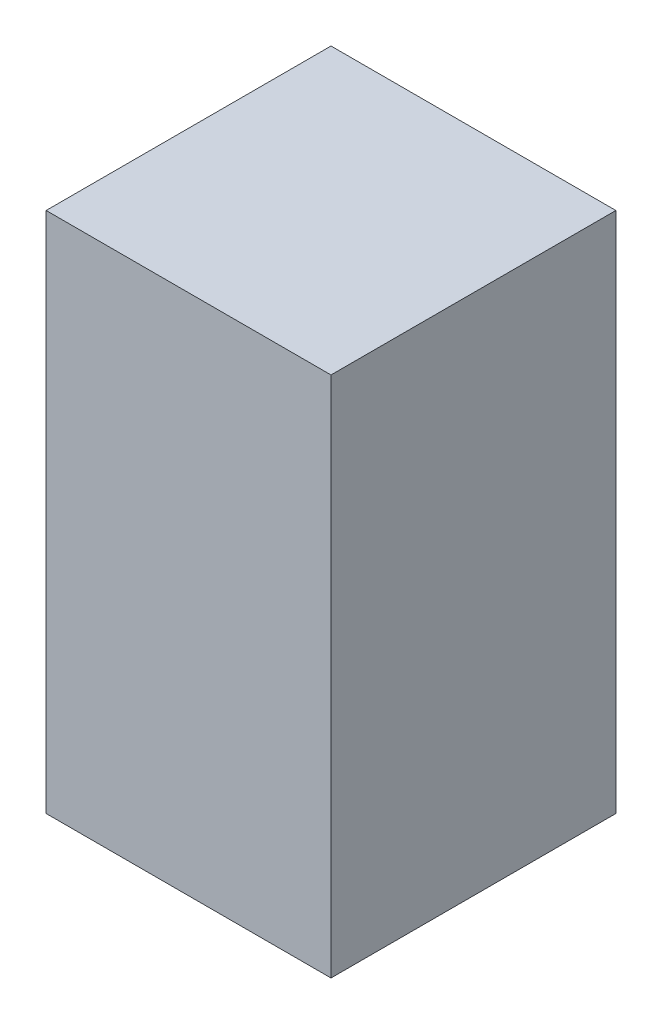
ISO-10303-21;
HEADER;
FILE_DESCRIPTION(('STEP AP214'),'2;1');
FILE_NAME('part.step','',(''),(''),'','','');
FILE_SCHEMA(('AUTOMOTIVE_DESIGN { 1 0 10303 214 1 1 1 1 }'));
ENDSEC;
DATA;
#1=APPLICATION_CONTEXT('core data for automotive mechanical design processes');
#2=APPLICATION_PROTOCOL_DEFINITION('international standard','automotive_design',2000,#1);
#3=PRODUCT_CONTEXT('',#1,'mechanical');
#4=PRODUCT('Part','Part','',(#3));
#5=PRODUCT_RELATED_PRODUCT_CATEGORY('part','',(#4));
#6=PRODUCT_DEFINITION_FORMATION('','',#4);
#7=PRODUCT_DEFINITION_CONTEXT('part definition',#1,'design');
#8=PRODUCT_DEFINITION('design','',#6,#7);
#9=PRODUCT_DEFINITION_SHAPE('','',#8);
#10=(LENGTH_UNIT() NAMED_UNIT(*) SI_UNIT(.MILLI.,.METRE.));
#11=(NAMED_UNIT(*) PLANE_ANGLE_UNIT() SI_UNIT($,.RADIAN.));
#12=(NAMED_UNIT(*) SI_UNIT($,.STERADIAN.) SOLID_ANGLE_UNIT());
#13=UNCERTAINTY_MEASURE_WITH_UNIT(LENGTH_MEASURE(1.E-05),#10,'distance_accuracy_value','');
#14=(GEOMETRIC_REPRESENTATION_CONTEXT(3) GLOBAL_UNCERTAINTY_ASSIGNED_CONTEXT((#13)) GLOBAL_UNIT_ASSIGNED_CONTEXT((#10,
#11,#12)) REPRESENTATION_CONTEXT('',''));
#15=CARTESIAN_POINT('',(0.,0.,0.));
#16=DIRECTION('',(0.,0.,1.));
#17=DIRECTION('',(1.,0.,0.));
#18=AXIS2_PLACEMENT_3D('',#15,#16,#17);
#19=CARTESIAN_POINT('',(0.90000074,1.65000178,1.79999894));
#20=DIRECTION('',(0.,0.,-1.));
#21=DIRECTION('',(0.,-1.,0.));
#22=AXIS2_PLACEMENT_3D('',#19,#20,#21);
#23=PLANE('',#22);
#24=DIRECTION('',(-1.,0.,0.));
#25=VECTOR('',#24,1.);
#26=CARTESIAN_POINT('',(0.90000074,1.65000178,1.79999894));
#27=LINE('',#26,#25);
#28=CARTESIAN_POINT('',(0.90000074,1.65000178,1.79999894));
#29=VERTEX_POINT('',#28);
#30=CARTESIAN_POINT('',(-0.8999982,1.65000178,1.79999894));
#31=VERTEX_POINT('',#30);
#32=EDGE_CURVE('E75',#29,#31,#27,.T.);
#33=ORIENTED_EDGE('',*,*,#32,.T.);
#34=DIRECTION('',(0.,-1.,0.));
#35=VECTOR('',#34,1.);
#36=CARTESIAN_POINT('',(-0.8999982,1.65000178,1.79999894));
#37=LINE('',#36,#35);
#38=CARTESIAN_POINT('',(-0.8999982,-1.64999924,1.79999894));
#39=VERTEX_POINT('',#38);
#40=EDGE_CURVE('E99',#31,#39,#37,.T.);
#41=ORIENTED_EDGE('',*,*,#40,.T.);
#42=DIRECTION('',(1.,0.,0.));
#43=VECTOR('',#42,1.);
#44=CARTESIAN_POINT('',(-0.8999982,-1.64999924,1.79999894));
#45=LINE('',#44,#43);
#46=CARTESIAN_POINT('',(0.90000074,-1.64999924,1.79999894));
#47=VERTEX_POINT('',#46);
#48=EDGE_CURVE('E78',#39,#47,#45,.T.);
#49=ORIENTED_EDGE('',*,*,#48,.T.);
#50=DIRECTION('',(0.,1.,0.));
#51=VECTOR('',#50,1.);
#52=CARTESIAN_POINT('',(0.90000074,-1.64999924,1.79999894));
#53=LINE('',#52,#51);
#54=EDGE_CURVE('E11',#47,#29,#53,.T.);
#55=ORIENTED_EDGE('',*,*,#54,.T.);
#56=EDGE_LOOP('',(#33,#41,#49,#55));
#57=FACE_BOUND('',#56,.T.);
#58=ADVANCED_FACE('F16',(#57),#23,.F.);
#59=CARTESIAN_POINT('',(0.90000074,1.65000178,0.));
#60=DIRECTION('',(0.,0.,-1.));
#61=DIRECTION('',(0.,-1.,0.));
#62=AXIS2_PLACEMENT_3D('',#59,#60,#61);
#63=PLANE('',#62);
#64=DIRECTION('',(0.,1.,0.));
#65=VECTOR('',#64,1.);
#66=CARTESIAN_POINT('',(0.90000074,-1.64999924,0.));
#67=LINE('',#66,#65);
#68=CARTESIAN_POINT('',(0.90000074,-1.64999924,0.));
#69=VERTEX_POINT('',#68);
#70=CARTESIAN_POINT('',(0.90000074,1.65000178,0.));
#71=VERTEX_POINT('',#70);
#72=EDGE_CURVE('E27',#69,#71,#67,.T.);
#73=ORIENTED_EDGE('',*,*,#72,.F.);
#74=DIRECTION('',(1.,0.,0.));
#75=VECTOR('',#74,1.);
#76=CARTESIAN_POINT('',(-0.8999982,-1.64999924,0.));
#77=LINE('',#76,#75);
#78=CARTESIAN_POINT('',(-0.8999982,-1.64999924,0.));
#79=VERTEX_POINT('',#78);
#80=EDGE_CURVE('E102',#79,#69,#77,.T.);
#81=ORIENTED_EDGE('',*,*,#80,.F.);
#82=DIRECTION('',(0.,-1.,0.));
#83=VECTOR('',#82,1.);
#84=CARTESIAN_POINT('',(-0.8999982,1.65000178,0.));
#85=LINE('',#84,#83);
#86=CARTESIAN_POINT('',(-0.8999982,1.65000178,0.));
#87=VERTEX_POINT('',#86);
#88=EDGE_CURVE('E58',#87,#79,#85,.T.);
#89=ORIENTED_EDGE('',*,*,#88,.F.);
#90=DIRECTION('',(-1.,0.,0.));
#91=VECTOR('',#90,1.);
#92=CARTESIAN_POINT('',(0.90000074,1.65000178,0.));
#93=LINE('',#92,#91);
#94=EDGE_CURVE('E94',#71,#87,#93,.T.);
#95=ORIENTED_EDGE('',*,*,#94,.F.);
#96=EDGE_LOOP('',(#73,#81,#89,#95));
#97=FACE_BOUND('',#96,.T.);
#98=ADVANCED_FACE('F18',(#97),#63,.T.);
#99=CARTESIAN_POINT('',(0.90000074,-1.64999924,0.));
#100=DIRECTION('',(-1.,0.,0.));
#101=DIRECTION('',(0.,0.,1.));
#102=AXIS2_PLACEMENT_3D('',#99,#100,#101);
#103=PLANE('',#102);
#104=ORIENTED_EDGE('',*,*,#72,.T.);
#105=DIRECTION('',(0.,0.,1.));
#106=VECTOR('',#105,1.);
#107=CARTESIAN_POINT('',(0.90000074,1.65000178,0.));
#108=LINE('',#107,#106);
#109=EDGE_CURVE('E80',#71,#29,#108,.T.);
#110=ORIENTED_EDGE('',*,*,#109,.T.);
#111=ORIENTED_EDGE('',*,*,#54,.F.);
#112=DIRECTION('',(0.,0.,1.));
#113=VECTOR('',#112,1.);
#114=CARTESIAN_POINT('',(0.90000074,-1.64999924,0.));
#115=LINE('',#114,#113);
#116=EDGE_CURVE('E103',#69,#47,#115,.T.);
#117=ORIENTED_EDGE('',*,*,#116,.F.);
#118=EDGE_LOOP('',(#104,#110,#111,#117));
#119=FACE_BOUND('',#118,.T.);
#120=ADVANCED_FACE('F81',(#119),#103,.F.);
#121=CARTESIAN_POINT('',(-0.8999982,-1.64999924,0.));
#122=DIRECTION('',(0.,1.,0.));
#123=DIRECTION('',(1.,0.,0.));
#124=AXIS2_PLACEMENT_3D('',#121,#122,#123);
#125=PLANE('',#124);
#126=ORIENTED_EDGE('',*,*,#80,.T.);
#127=ORIENTED_EDGE('',*,*,#116,.T.);
#128=ORIENTED_EDGE('',*,*,#48,.F.);
#129=DIRECTION('',(0.,0.,1.));
#130=VECTOR('',#129,1.);
#131=CARTESIAN_POINT('',(-0.8999982,-1.64999924,0.));
#132=LINE('',#131,#130);
#133=EDGE_CURVE('E20',#79,#39,#132,.T.);
#134=ORIENTED_EDGE('',*,*,#133,.F.);
#135=EDGE_LOOP('',(#126,#127,#128,#134));
#136=FACE_BOUND('',#135,.T.);
#137=ADVANCED_FACE('F156',(#136),#125,.F.);
#138=CARTESIAN_POINT('',(-0.8999982,1.65000178,0.));
#139=DIRECTION('',(1.,0.,0.));
#140=DIRECTION('',(0.,1.,0.));
#141=AXIS2_PLACEMENT_3D('',#138,#139,#140);
#142=PLANE('',#141);
#143=ORIENTED_EDGE('',*,*,#88,.T.);
#144=ORIENTED_EDGE('',*,*,#133,.T.);
#145=ORIENTED_EDGE('',*,*,#40,.F.);
#146=DIRECTION('',(0.,0.,1.));
#147=VECTOR('',#146,1.);
#148=CARTESIAN_POINT('',(-0.8999982,1.65000178,0.));
#149=LINE('',#148,#147);
#150=EDGE_CURVE('E87',#87,#31,#149,.T.);
#151=ORIENTED_EDGE('',*,*,#150,.F.);
#152=EDGE_LOOP('',(#143,#144,#145,#151));
#153=FACE_BOUND('',#152,.T.);
#154=ADVANCED_FACE('F158',(#153),#142,.F.);
#155=CARTESIAN_POINT('',(0.90000074,1.65000178,0.));
#156=DIRECTION('',(0.,-1.,0.));
#157=DIRECTION('',(0.,0.,-1.));
#158=AXIS2_PLACEMENT_3D('',#155,#156,#157);
#159=PLANE('',#158);
#160=ORIENTED_EDGE('',*,*,#94,.T.);
#161=ORIENTED_EDGE('',*,*,#150,.T.);
#162=ORIENTED_EDGE('',*,*,#32,.F.);
#163=ORIENTED_EDGE('',*,*,#109,.F.);
#164=EDGE_LOOP('',(#160,#161,#162,#163));
#165=FACE_BOUND('',#164,.T.);
#166=ADVANCED_FACE('F86',(#165),#159,.F.);
#167=CLOSED_SHELL('',(#58,#98,#120,#137,#154,#166));
#168=MANIFOLD_SOLID_BREP('B1',#167);
#169=ADVANCED_BREP_SHAPE_REPRESENTATION('',(#18,#168),#14);
#170=SHAPE_DEFINITION_REPRESENTATION(#9,#169);
ENDSEC;
END-ISO-10303-21;
